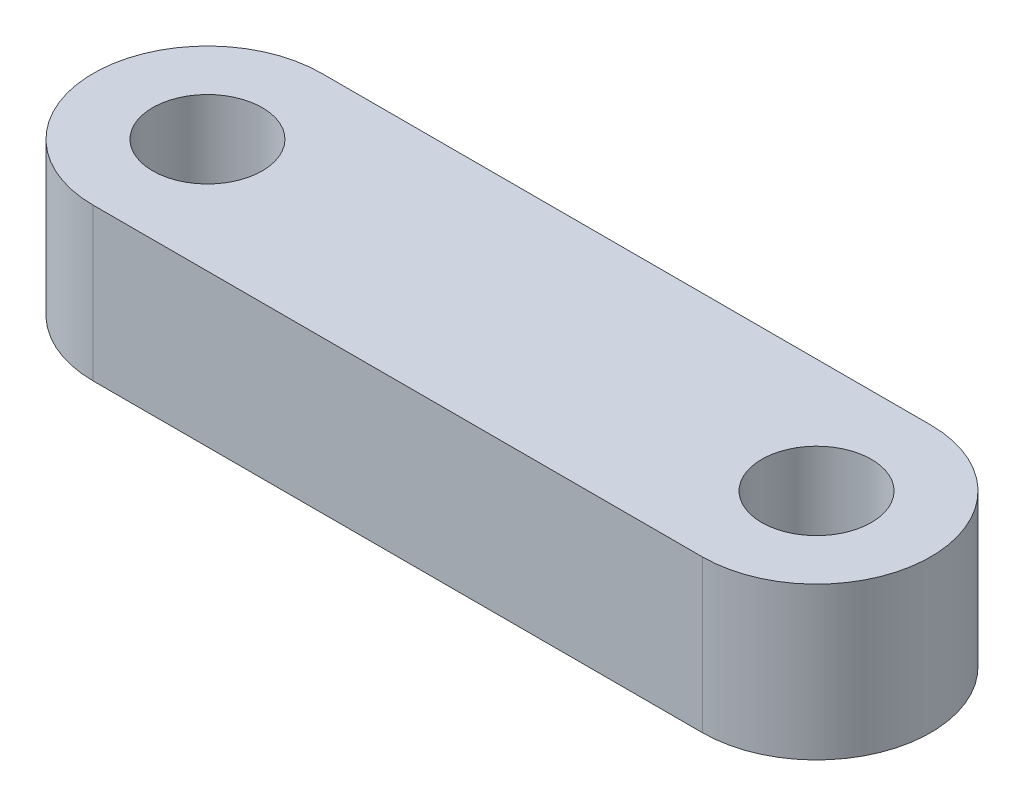
ISO-10303-21;
HEADER;
FILE_DESCRIPTION(('STEP AP214'),'2;1');
FILE_NAME('part.step','',(''),(''),'','','');
FILE_SCHEMA(('AUTOMOTIVE_DESIGN { 1 0 10303 214 1 1 1 1 }'));
ENDSEC;
DATA;
#1=APPLICATION_CONTEXT('core data for automotive mechanical design processes');
#2=APPLICATION_PROTOCOL_DEFINITION('international standard','automotive_design',2000,#1);
#3=PRODUCT_CONTEXT('',#1,'mechanical');
#4=PRODUCT('Part','Part','',(#3));
#5=PRODUCT_RELATED_PRODUCT_CATEGORY('part','',(#4));
#6=PRODUCT_DEFINITION_FORMATION('','',#4);
#7=PRODUCT_DEFINITION_CONTEXT('part definition',#1,'design');
#8=PRODUCT_DEFINITION('design','',#6,#7);
#9=PRODUCT_DEFINITION_SHAPE('','',#8);
#10=(LENGTH_UNIT() NAMED_UNIT(*) SI_UNIT(.MILLI.,.METRE.));
#11=(NAMED_UNIT(*) PLANE_ANGLE_UNIT() SI_UNIT($,.RADIAN.));
#12=(NAMED_UNIT(*) SI_UNIT($,.STERADIAN.) SOLID_ANGLE_UNIT());
#13=UNCERTAINTY_MEASURE_WITH_UNIT(LENGTH_MEASURE(1.E-05),#10,'distance_accuracy_value','');
#14=(GEOMETRIC_REPRESENTATION_CONTEXT(3) GLOBAL_UNCERTAINTY_ASSIGNED_CONTEXT((#13)) GLOBAL_UNIT_ASSIGNED_CONTEXT((#10,
#11,#12)) REPRESENTATION_CONTEXT('',''));
#15=CARTESIAN_POINT('',(0.,0.,0.));
#16=DIRECTION('',(0.,0.,1.));
#17=DIRECTION('',(1.,0.,0.));
#18=AXIS2_PLACEMENT_3D('',#15,#16,#17);
#19=CARTESIAN_POINT('',(0.,6.35,0.));
#20=DIRECTION('',(0.,1.,0.));
#21=DIRECTION('',(0.,0.,1.));
#22=AXIS2_PLACEMENT_3D('',#19,#20,#21);
#23=PLANE('',#22);
#24=CARTESIAN_POINT('',(-25.4,6.35,0.));
#25=DIRECTION('',(0.,1.,0.));
#26=DIRECTION('',(0.,0.,1.));
#27=AXIS2_PLACEMENT_3D('',#24,#25,#26);
#28=CIRCLE('',#27,2.286);
#29=CARTESIAN_POINT('',(-25.4,6.35,2.286));
#30=VERTEX_POINT('',#29);
#31=EDGE_CURVE('E130',#30,#30,#28,.T.);
#32=ORIENTED_EDGE('',*,*,#31,.F.);
#33=EDGE_LOOP('',(#32));
#34=FACE_BOUND('',#33,.T.);
#35=CARTESIAN_POINT('',(0.,6.35,0.));
#36=DIRECTION('',(0.,1.,0.));
#37=DIRECTION('',(0.,0.,1.));
#38=AXIS2_PLACEMENT_3D('',#35,#36,#37);
#39=CIRCLE('',#38,4.7625);
#40=CARTESIAN_POINT('',(0.,6.35,4.7625));
#41=VERTEX_POINT('',#40);
#42=CARTESIAN_POINT('',(0.,6.35,-4.7625));
#43=VERTEX_POINT('',#42);
#44=EDGE_CURVE('E110',#41,#43,#39,.T.);
#45=ORIENTED_EDGE('',*,*,#44,.T.);
#46=DIRECTION('',(-1.,0.,0.));
#47=VECTOR('',#46,1.);
#48=CARTESIAN_POINT('',(0.,6.35,-4.7625));
#49=LINE('',#48,#47);
#50=CARTESIAN_POINT('',(-25.4,6.35,-4.7625));
#51=VERTEX_POINT('',#50);
#52=EDGE_CURVE('E104',#43,#51,#49,.T.);
#53=ORIENTED_EDGE('',*,*,#52,.T.);
#54=CARTESIAN_POINT('',(-25.4,6.35,0.));
#55=DIRECTION('',(0.,1.,0.));
#56=DIRECTION('',(0.,0.,1.));
#57=AXIS2_PLACEMENT_3D('',#54,#55,#56);
#58=CIRCLE('',#57,4.7625);
#59=CARTESIAN_POINT('',(-25.4,6.35,4.7625));
#60=VERTEX_POINT('',#59);
#61=EDGE_CURVE('E108',#51,#60,#58,.T.);
#62=ORIENTED_EDGE('',*,*,#61,.T.);
#63=DIRECTION('',(1.,0.,0.));
#64=VECTOR('',#63,1.);
#65=CARTESIAN_POINT('',(0.,6.35,4.7625));
#66=LINE('',#65,#64);
#67=EDGE_CURVE('E70',#60,#41,#66,.T.);
#68=ORIENTED_EDGE('',*,*,#67,.T.);
#69=EDGE_LOOP('',(#45,#53,#62,#68));
#70=FACE_BOUND('',#69,.T.);
#71=CARTESIAN_POINT('',(0.,6.35,0.));
#72=DIRECTION('',(0.,1.,0.));
#73=DIRECTION('',(0.,0.,1.));
#74=AXIS2_PLACEMENT_3D('',#71,#72,#73);
#75=CIRCLE('',#74,2.286);
#76=CARTESIAN_POINT('',(0.,6.35,2.286));
#77=VERTEX_POINT('',#76);
#78=EDGE_CURVE('E152',#77,#77,#75,.T.);
#79=ORIENTED_EDGE('',*,*,#78,.F.);
#80=EDGE_LOOP('',(#79));
#81=FACE_BOUND('',#80,.T.);
#82=ADVANCED_FACE('F49',(#34,#70,#81),#23,.T.);
#83=CARTESIAN_POINT('',(0.,0.,0.));
#84=DIRECTION('',(0.,1.,0.));
#85=DIRECTION('',(0.,0.,1.));
#86=AXIS2_PLACEMENT_3D('',#83,#84,#85);
#87=PLANE('',#86);
#88=CARTESIAN_POINT('',(0.,0.,0.));
#89=DIRECTION('',(0.,1.,0.));
#90=DIRECTION('',(0.,0.,1.));
#91=AXIS2_PLACEMENT_3D('',#88,#89,#90);
#92=CIRCLE('',#91,4.7625);
#93=CARTESIAN_POINT('',(0.,0.,4.7625));
#94=VERTEX_POINT('',#93);
#95=CARTESIAN_POINT('',(0.,0.,-4.7625));
#96=VERTEX_POINT('',#95);
#97=EDGE_CURVE('E126',#94,#96,#92,.T.);
#98=ORIENTED_EDGE('',*,*,#97,.F.);
#99=DIRECTION('',(1.,0.,0.));
#100=VECTOR('',#99,1.);
#101=CARTESIAN_POINT('',(0.,0.,4.7625));
#102=LINE('',#101,#100);
#103=CARTESIAN_POINT('',(-25.4,0.,4.7625));
#104=VERTEX_POINT('',#103);
#105=EDGE_CURVE('E97',#104,#94,#102,.T.);
#106=ORIENTED_EDGE('',*,*,#105,.F.);
#107=CARTESIAN_POINT('',(-25.4,0.,0.));
#108=DIRECTION('',(0.,1.,0.));
#109=DIRECTION('',(0.,0.,1.));
#110=AXIS2_PLACEMENT_3D('',#107,#108,#109);
#111=CIRCLE('',#110,4.7625);
#112=CARTESIAN_POINT('',(-25.4,0.,-4.7625));
#113=VERTEX_POINT('',#112);
#114=EDGE_CURVE('E91',#113,#104,#111,.T.);
#115=ORIENTED_EDGE('',*,*,#114,.F.);
#116=DIRECTION('',(-1.,0.,0.));
#117=VECTOR('',#116,1.);
#118=CARTESIAN_POINT('',(0.,0.,-4.7625));
#119=LINE('',#118,#117);
#120=EDGE_CURVE('E115',#96,#113,#119,.T.);
#121=ORIENTED_EDGE('',*,*,#120,.F.);
#122=EDGE_LOOP('',(#98,#106,#115,#121));
#123=FACE_BOUND('',#122,.T.);
#124=CARTESIAN_POINT('',(-25.4,0.,0.));
#125=DIRECTION('',(0.,1.,0.));
#126=DIRECTION('',(0.,0.,1.));
#127=AXIS2_PLACEMENT_3D('',#124,#125,#126);
#128=CIRCLE('',#127,2.286);
#129=CARTESIAN_POINT('',(-25.4,0.,2.286));
#130=VERTEX_POINT('',#129);
#131=EDGE_CURVE('E148',#130,#130,#128,.T.);
#132=ORIENTED_EDGE('',*,*,#131,.T.);
#133=EDGE_LOOP('',(#132));
#134=FACE_BOUND('',#133,.T.);
#135=CARTESIAN_POINT('',(0.,0.,0.));
#136=DIRECTION('',(0.,1.,0.));
#137=DIRECTION('',(0.,0.,1.));
#138=AXIS2_PLACEMENT_3D('',#135,#136,#137);
#139=CIRCLE('',#138,2.286);
#140=CARTESIAN_POINT('',(0.,0.,2.286));
#141=VERTEX_POINT('',#140);
#142=EDGE_CURVE('E156',#141,#141,#139,.T.);
#143=ORIENTED_EDGE('',*,*,#142,.T.);
#144=EDGE_LOOP('',(#143));
#145=FACE_BOUND('',#144,.T.);
#146=ADVANCED_FACE('F143',(#123,#134,#145),#87,.F.);
#147=CARTESIAN_POINT('',(0.,6.35,0.));
#148=DIRECTION('',(0.,-1.,0.));
#149=DIRECTION('',(0.,0.,-1.));
#150=AXIS2_PLACEMENT_3D('',#147,#148,#149);
#151=CYLINDRICAL_SURFACE('',#150,4.7625);
#152=ORIENTED_EDGE('',*,*,#97,.T.);
#153=DIRECTION('',(0.,-1.,0.));
#154=VECTOR('',#153,1.);
#155=CARTESIAN_POINT('',(0.,6.35,-4.7625));
#156=LINE('',#155,#154);
#157=EDGE_CURVE('E11',#43,#96,#156,.T.);
#158=ORIENTED_EDGE('',*,*,#157,.F.);
#159=ORIENTED_EDGE('',*,*,#44,.F.);
#160=DIRECTION('',(0.,-1.,0.));
#161=VECTOR('',#160,1.);
#162=CARTESIAN_POINT('',(0.,6.35,4.7625));
#163=LINE('',#162,#161);
#164=EDGE_CURVE('E122',#41,#94,#163,.T.);
#165=ORIENTED_EDGE('',*,*,#164,.T.);
#166=EDGE_LOOP('',(#152,#158,#159,#165));
#167=FACE_BOUND('',#166,.T.);
#168=ADVANCED_FACE('F51',(#167),#151,.T.);
#169=CARTESIAN_POINT('',(0.,6.35,-4.7625));
#170=DIRECTION('',(0.,0.,1.));
#171=DIRECTION('',(1.,0.,0.));
#172=AXIS2_PLACEMENT_3D('',#169,#170,#171);
#173=PLANE('',#172);
#174=ORIENTED_EDGE('',*,*,#120,.T.);
#175=DIRECTION('',(0.,-1.,0.));
#176=VECTOR('',#175,1.);
#177=CARTESIAN_POINT('',(-25.4,6.35,-4.7625));
#178=LINE('',#177,#176);
#179=EDGE_CURVE('E59',#51,#113,#178,.T.);
#180=ORIENTED_EDGE('',*,*,#179,.F.);
#181=ORIENTED_EDGE('',*,*,#52,.F.);
#182=ORIENTED_EDGE('',*,*,#157,.T.);
#183=EDGE_LOOP('',(#174,#180,#181,#182));
#184=FACE_BOUND('',#183,.T.);
#185=ADVANCED_FACE('F114',(#184),#173,.F.);
#186=CARTESIAN_POINT('',(-25.4,6.35,0.));
#187=DIRECTION('',(0.,-1.,0.));
#188=DIRECTION('',(0.,0.,-1.));
#189=AXIS2_PLACEMENT_3D('',#186,#187,#188);
#190=CYLINDRICAL_SURFACE('',#189,4.7625);
#191=ORIENTED_EDGE('',*,*,#114,.T.);
#192=DIRECTION('',(0.,-1.,0.));
#193=VECTOR('',#192,1.);
#194=CARTESIAN_POINT('',(-25.4,6.35,4.7625));
#195=LINE('',#194,#193);
#196=EDGE_CURVE('E117',#60,#104,#195,.T.);
#197=ORIENTED_EDGE('',*,*,#196,.F.);
#198=ORIENTED_EDGE('',*,*,#61,.F.);
#199=ORIENTED_EDGE('',*,*,#179,.T.);
#200=EDGE_LOOP('',(#191,#197,#198,#199));
#201=FACE_BOUND('',#200,.T.);
#202=ADVANCED_FACE('F118',(#201),#190,.T.);
#203=CARTESIAN_POINT('',(0.,6.35,4.7625));
#204=DIRECTION('',(0.,0.,-1.));
#205=DIRECTION('',(-1.,0.,0.));
#206=AXIS2_PLACEMENT_3D('',#203,#204,#205);
#207=PLANE('',#206);
#208=ORIENTED_EDGE('',*,*,#105,.T.);
#209=ORIENTED_EDGE('',*,*,#164,.F.);
#210=ORIENTED_EDGE('',*,*,#67,.F.);
#211=ORIENTED_EDGE('',*,*,#196,.T.);
#212=EDGE_LOOP('',(#208,#209,#210,#211));
#213=FACE_BOUND('',#212,.T.);
#214=ADVANCED_FACE('F140',(#213),#207,.F.);
#215=CARTESIAN_POINT('',(-25.4,6.35,0.));
#216=DIRECTION('',(0.,-1.,0.));
#217=DIRECTION('',(0.,0.,-1.));
#218=AXIS2_PLACEMENT_3D('',#215,#216,#217);
#219=CYLINDRICAL_SURFACE('',#218,2.286);
#220=ORIENTED_EDGE('',*,*,#31,.T.);
#221=EDGE_LOOP('',(#220));
#222=FACE_BOUND('',#221,.T.);
#223=ORIENTED_EDGE('',*,*,#131,.F.);
#224=EDGE_LOOP('',(#223));
#225=FACE_BOUND('',#224,.T.);
#226=ADVANCED_FACE('F175',(#222,#225),#219,.F.);
#227=CARTESIAN_POINT('',(0.,6.35,0.));
#228=DIRECTION('',(0.,-1.,0.));
#229=DIRECTION('',(0.,0.,-1.));
#230=AXIS2_PLACEMENT_3D('',#227,#228,#229);
#231=CYLINDRICAL_SURFACE('',#230,2.286);
#232=ORIENTED_EDGE('',*,*,#78,.T.);
#233=EDGE_LOOP('',(#232));
#234=FACE_BOUND('',#233,.T.);
#235=ORIENTED_EDGE('',*,*,#142,.F.);
#236=EDGE_LOOP('',(#235));
#237=FACE_BOUND('',#236,.T.);
#238=ADVANCED_FACE('F164',(#234,#237),#231,.F.);
#239=CLOSED_SHELL('',(#82,#146,#168,#185,#202,#214,#226,#238));
#240=MANIFOLD_SOLID_BREP('B2',#239);
#241=ADVANCED_BREP_SHAPE_REPRESENTATION('',(#18,#240),#14);
#242=SHAPE_DEFINITION_REPRESENTATION(#9,#241);
ENDSEC;
END-ISO-10303-21;
